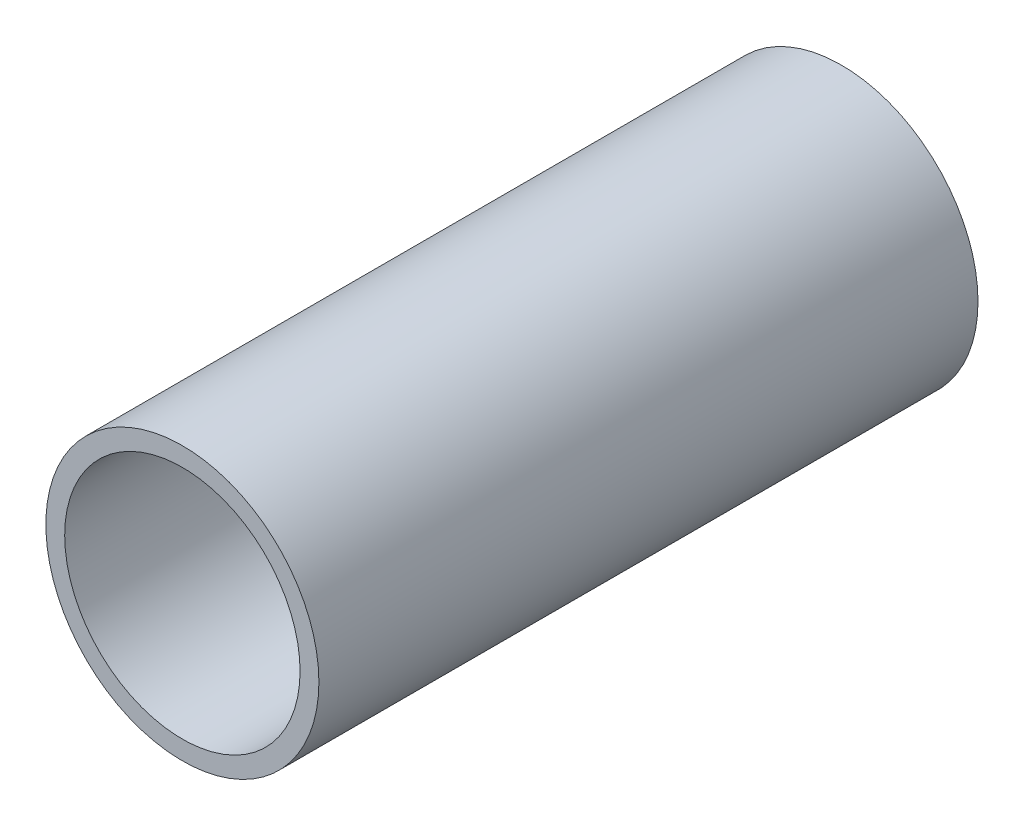
ISO-10303-21;
HEADER;
FILE_DESCRIPTION(('STEP AP214'),'2;1');
FILE_NAME('part.step','',(''),(''),'','','');
FILE_SCHEMA(('AUTOMOTIVE_DESIGN { 1 0 10303 214 1 1 1 1 }'));
ENDSEC;
DATA;
#1=APPLICATION_CONTEXT('core data for automotive mechanical design processes');
#2=APPLICATION_PROTOCOL_DEFINITION('international standard','automotive_design',2000,#1);
#3=PRODUCT_CONTEXT('',#1,'mechanical');
#4=PRODUCT('Part','Part','',(#3));
#5=PRODUCT_RELATED_PRODUCT_CATEGORY('part','',(#4));
#6=PRODUCT_DEFINITION_FORMATION('','',#4);
#7=PRODUCT_DEFINITION_CONTEXT('part definition',#1,'design');
#8=PRODUCT_DEFINITION('design','',#6,#7);
#9=PRODUCT_DEFINITION_SHAPE('','',#8);
#10=(LENGTH_UNIT() NAMED_UNIT(*) SI_UNIT(.MILLI.,.METRE.));
#11=(NAMED_UNIT(*) PLANE_ANGLE_UNIT() SI_UNIT($,.RADIAN.));
#12=(NAMED_UNIT(*) SI_UNIT($,.STERADIAN.) SOLID_ANGLE_UNIT());
#13=UNCERTAINTY_MEASURE_WITH_UNIT(LENGTH_MEASURE(1.E-05),#10,'distance_accuracy_value','');
#14=(GEOMETRIC_REPRESENTATION_CONTEXT(3) GLOBAL_UNCERTAINTY_ASSIGNED_CONTEXT((#13)) GLOBAL_UNIT_ASSIGNED_CONTEXT((#10,
#11,#12)) REPRESENTATION_CONTEXT('',''));
#15=CARTESIAN_POINT('',(0.,0.,0.));
#16=DIRECTION('',(0.,0.,1.));
#17=DIRECTION('',(1.,0.,0.));
#18=AXIS2_PLACEMENT_3D('',#15,#16,#17);
#19=CARTESIAN_POINT('',(0.,0.,70.));
#20=DIRECTION('',(0.,0.,1.));
#21=DIRECTION('',(1.,0.,0.));
#22=AXIS2_PLACEMENT_3D('',#19,#20,#21);
#23=PLANE('',#22);
#24=CARTESIAN_POINT('',(0.,0.,70.));
#25=DIRECTION('',(0.,0.,1.));
#26=DIRECTION('',(1.,0.,0.));
#27=AXIS2_PLACEMENT_3D('',#24,#25,#26);
#28=CIRCLE('',#27,14.5);
#29=CARTESIAN_POINT('',(14.5,0.,70.));
#30=VERTEX_POINT('',#29);
#31=EDGE_CURVE('E10',#30,#30,#28,.T.);
#32=ORIENTED_EDGE('',*,*,#31,.T.);
#33=EDGE_LOOP('',(#32));
#34=FACE_BOUND('',#33,.T.);
#35=CARTESIAN_POINT('',(0.,0.,70.));
#36=DIRECTION('',(0.,0.,1.));
#37=DIRECTION('',(1.,0.,0.));
#38=AXIS2_PLACEMENT_3D('',#35,#36,#37);
#39=CIRCLE('',#38,12.5);
#40=CARTESIAN_POINT('',(12.5,0.,70.));
#41=VERTEX_POINT('',#40);
#42=EDGE_CURVE('E52',#41,#41,#39,.T.);
#43=ORIENTED_EDGE('',*,*,#42,.F.);
#44=EDGE_LOOP('',(#43));
#45=FACE_BOUND('',#44,.T.);
#46=ADVANCED_FACE('F40',(#34,#45),#23,.T.);
#47=CARTESIAN_POINT('',(0.,0.,0.));
#48=DIRECTION('',(0.,0.,1.));
#49=DIRECTION('',(1.,0.,0.));
#50=AXIS2_PLACEMENT_3D('',#47,#48,#49);
#51=PLANE('',#50);
#52=CARTESIAN_POINT('',(0.,0.,0.));
#53=DIRECTION('',(0.,0.,1.));
#54=DIRECTION('',(1.,0.,0.));
#55=AXIS2_PLACEMENT_3D('',#52,#53,#54);
#56=CIRCLE('',#55,14.5);
#57=CARTESIAN_POINT('',(14.5,0.,0.));
#58=VERTEX_POINT('',#57);
#59=EDGE_CURVE('E45',#58,#58,#56,.T.);
#60=ORIENTED_EDGE('',*,*,#59,.F.);
#61=EDGE_LOOP('',(#60));
#62=FACE_BOUND('',#61,.T.);
#63=CARTESIAN_POINT('',(0.,0.,0.));
#64=DIRECTION('',(0.,0.,1.));
#65=DIRECTION('',(1.,0.,0.));
#66=AXIS2_PLACEMENT_3D('',#63,#64,#65);
#67=CIRCLE('',#66,12.5);
#68=CARTESIAN_POINT('',(12.5,0.,0.));
#69=VERTEX_POINT('',#68);
#70=EDGE_CURVE('E54',#69,#69,#67,.T.);
#71=ORIENTED_EDGE('',*,*,#70,.T.);
#72=EDGE_LOOP('',(#71));
#73=FACE_BOUND('',#72,.T.);
#74=ADVANCED_FACE('F64',(#62,#73),#51,.F.);
#75=CARTESIAN_POINT('',(0.,0.,70.));
#76=DIRECTION('',(0.,0.,-1.));
#77=DIRECTION('',(-1.,0.,0.));
#78=AXIS2_PLACEMENT_3D('',#75,#76,#77);
#79=CYLINDRICAL_SURFACE('',#78,14.5);
#80=ORIENTED_EDGE('',*,*,#31,.F.);
#81=EDGE_LOOP('',(#80));
#82=FACE_BOUND('',#81,.T.);
#83=ORIENTED_EDGE('',*,*,#59,.T.);
#84=EDGE_LOOP('',(#83));
#85=FACE_BOUND('',#84,.T.);
#86=ADVANCED_FACE('F43',(#82,#85),#79,.T.);
#87=CARTESIAN_POINT('',(0.,0.,70.));
#88=DIRECTION('',(0.,0.,-1.));
#89=DIRECTION('',(-1.,0.,0.));
#90=AXIS2_PLACEMENT_3D('',#87,#88,#89);
#91=CYLINDRICAL_SURFACE('',#90,12.5);
#92=ORIENTED_EDGE('',*,*,#42,.T.);
#93=EDGE_LOOP('',(#92));
#94=FACE_BOUND('',#93,.T.);
#95=ORIENTED_EDGE('',*,*,#70,.F.);
#96=EDGE_LOOP('',(#95));
#97=FACE_BOUND('',#96,.T.);
#98=ADVANCED_FACE('F60',(#94,#97),#91,.F.);
#99=CLOSED_SHELL('',(#46,#74,#86,#98));
#100=MANIFOLD_SOLID_BREP('B2',#99);
#101=ADVANCED_BREP_SHAPE_REPRESENTATION('',(#18,#100),#14);
#102=SHAPE_DEFINITION_REPRESENTATION(#9,#101);
ENDSEC;
END-ISO-10303-21;
